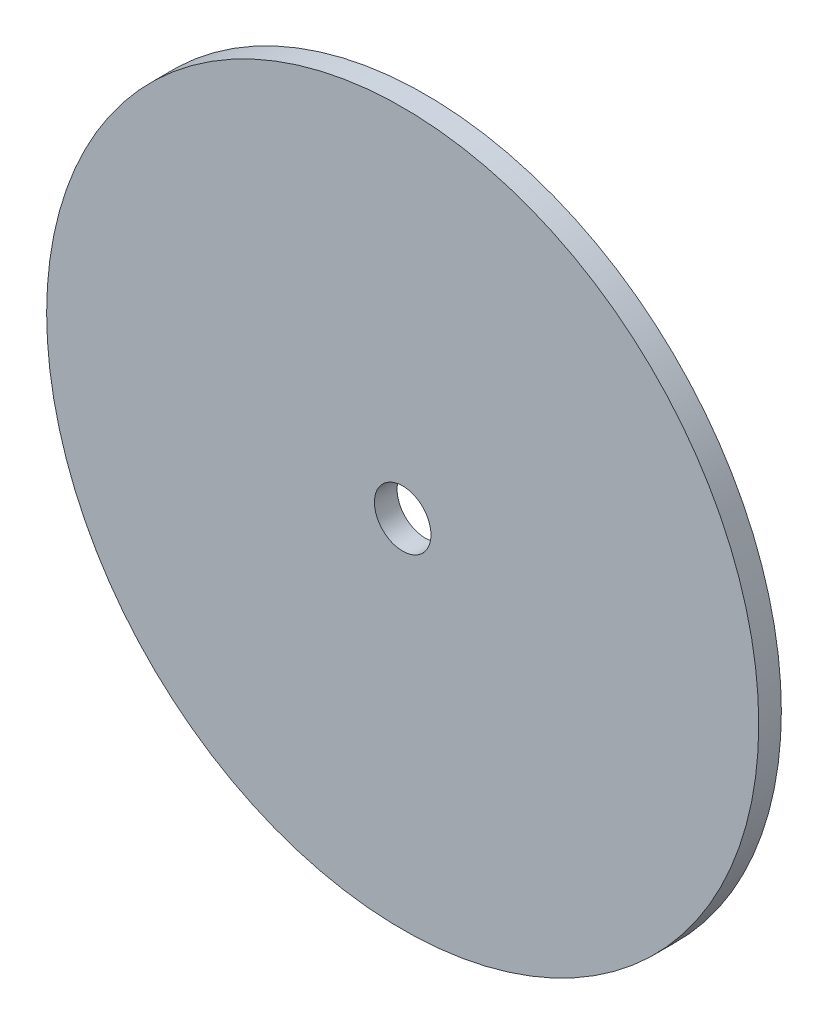
ISO-10303-21;
HEADER;
FILE_DESCRIPTION(('STEP AP214'),'2;1');
FILE_NAME('part.step','',(''),(''),'','','');
FILE_SCHEMA(('AUTOMOTIVE_DESIGN { 1 0 10303 214 1 1 1 1 }'));
ENDSEC;
DATA;
#1=APPLICATION_CONTEXT('core data for automotive mechanical design processes');
#2=APPLICATION_PROTOCOL_DEFINITION('international standard','automotive_design',2000,#1);
#3=PRODUCT_CONTEXT('',#1,'mechanical');
#4=PRODUCT('Part','Part','',(#3));
#5=PRODUCT_RELATED_PRODUCT_CATEGORY('part','',(#4));
#6=PRODUCT_DEFINITION_FORMATION('','',#4);
#7=PRODUCT_DEFINITION_CONTEXT('part definition',#1,'design');
#8=PRODUCT_DEFINITION('design','',#6,#7);
#9=PRODUCT_DEFINITION_SHAPE('','',#8);
#10=(LENGTH_UNIT() NAMED_UNIT(*) SI_UNIT(.MILLI.,.METRE.));
#11=(NAMED_UNIT(*) PLANE_ANGLE_UNIT() SI_UNIT($,.RADIAN.));
#12=(NAMED_UNIT(*) SI_UNIT($,.STERADIAN.) SOLID_ANGLE_UNIT());
#13=UNCERTAINTY_MEASURE_WITH_UNIT(LENGTH_MEASURE(1.E-05),#10,'distance_accuracy_value','');
#14=(GEOMETRIC_REPRESENTATION_CONTEXT(3) GLOBAL_UNCERTAINTY_ASSIGNED_CONTEXT((#13)) GLOBAL_UNIT_ASSIGNED_CONTEXT((#10,
#11,#12)) REPRESENTATION_CONTEXT('',''));
#15=CARTESIAN_POINT('',(0.,0.,0.));
#16=DIRECTION('',(0.,0.,1.));
#17=DIRECTION('',(1.,0.,0.));
#18=AXIS2_PLACEMENT_3D('',#15,#16,#17);
#19=CARTESIAN_POINT('',(0.,0.,6.35));
#20=DIRECTION('',(0.,0.,1.));
#21=DIRECTION('',(1.,0.,0.));
#22=AXIS2_PLACEMENT_3D('',#19,#20,#21);
#23=PLANE('',#22);
#24=CARTESIAN_POINT('',(0.,0.,6.35));
#25=DIRECTION('',(0.,0.,1.));
#26=DIRECTION('',(1.,0.,0.));
#27=AXIS2_PLACEMENT_3D('',#24,#25,#26);
#28=CIRCLE('',#27,100.);
#29=CARTESIAN_POINT('',(100.,0.,6.35));
#30=VERTEX_POINT('',#29);
#31=EDGE_CURVE('E10',#30,#30,#28,.T.);
#32=ORIENTED_EDGE('',*,*,#31,.T.);
#33=EDGE_LOOP('',(#32));
#34=FACE_BOUND('',#33,.T.);
#35=CARTESIAN_POINT('',(0.,0.,6.35));
#36=DIRECTION('',(0.,0.,1.));
#37=DIRECTION('',(1.,0.,0.));
#38=AXIS2_PLACEMENT_3D('',#35,#36,#37);
#39=CIRCLE('',#38,7.9375);
#40=CARTESIAN_POINT('',(7.9375,0.,6.35));
#41=VERTEX_POINT('',#40);
#42=EDGE_CURVE('E50',#41,#41,#39,.T.);
#43=ORIENTED_EDGE('',*,*,#42,.F.);
#44=EDGE_LOOP('',(#43));
#45=FACE_BOUND('',#44,.T.);
#46=ADVANCED_FACE('F37',(#34,#45),#23,.T.);
#47=CARTESIAN_POINT('',(0.,0.,0.));
#48=DIRECTION('',(0.,0.,1.));
#49=DIRECTION('',(1.,0.,0.));
#50=AXIS2_PLACEMENT_3D('',#47,#48,#49);
#51=PLANE('',#50);
#52=CARTESIAN_POINT('',(0.,0.,0.));
#53=DIRECTION('',(0.,0.,1.));
#54=DIRECTION('',(1.,0.,0.));
#55=AXIS2_PLACEMENT_3D('',#52,#53,#54);
#56=CIRCLE('',#55,100.);
#57=CARTESIAN_POINT('',(100.,0.,0.));
#58=VERTEX_POINT('',#57);
#59=EDGE_CURVE('E41',#58,#58,#56,.T.);
#60=ORIENTED_EDGE('',*,*,#59,.F.);
#61=EDGE_LOOP('',(#60));
#62=FACE_BOUND('',#61,.T.);
#63=CARTESIAN_POINT('',(0.,0.,0.));
#64=DIRECTION('',(0.,0.,1.));
#65=DIRECTION('',(1.,0.,0.));
#66=AXIS2_PLACEMENT_3D('',#63,#64,#65);
#67=CIRCLE('',#66,7.9375);
#68=CARTESIAN_POINT('',(7.9375,0.,0.));
#69=VERTEX_POINT('',#68);
#70=EDGE_CURVE('E52',#69,#69,#67,.T.);
#71=ORIENTED_EDGE('',*,*,#70,.T.);
#72=EDGE_LOOP('',(#71));
#73=FACE_BOUND('',#72,.T.);
#74=ADVANCED_FACE('F64',(#62,#73),#51,.F.);
#75=CARTESIAN_POINT('',(0.,0.,6.35));
#76=DIRECTION('',(0.,0.,-1.));
#77=DIRECTION('',(-1.,0.,0.));
#78=AXIS2_PLACEMENT_3D('',#75,#76,#77);
#79=CYLINDRICAL_SURFACE('',#78,100.);
#80=ORIENTED_EDGE('',*,*,#31,.F.);
#81=EDGE_LOOP('',(#80));
#82=FACE_BOUND('',#81,.T.);
#83=ORIENTED_EDGE('',*,*,#59,.T.);
#84=EDGE_LOOP('',(#83));
#85=FACE_BOUND('',#84,.T.);
#86=ADVANCED_FACE('F39',(#82,#85),#79,.T.);
#87=CARTESIAN_POINT('',(0.,0.,6.35));
#88=DIRECTION('',(0.,0.,-1.));
#89=DIRECTION('',(-1.,0.,0.));
#90=AXIS2_PLACEMENT_3D('',#87,#88,#89);
#91=CYLINDRICAL_SURFACE('',#90,7.9375);
#92=ORIENTED_EDGE('',*,*,#42,.T.);
#93=EDGE_LOOP('',(#92));
#94=FACE_BOUND('',#93,.T.);
#95=ORIENTED_EDGE('',*,*,#70,.F.);
#96=EDGE_LOOP('',(#95));
#97=FACE_BOUND('',#96,.T.);
#98=ADVANCED_FACE('F60',(#94,#97),#91,.F.);
#99=CLOSED_SHELL('',(#46,#74,#86,#98));
#100=MANIFOLD_SOLID_BREP('B2',#99);
#101=ADVANCED_BREP_SHAPE_REPRESENTATION('',(#18,#100),#14);
#102=SHAPE_DEFINITION_REPRESENTATION(#9,#101);
ENDSEC;
END-ISO-10303-21;
